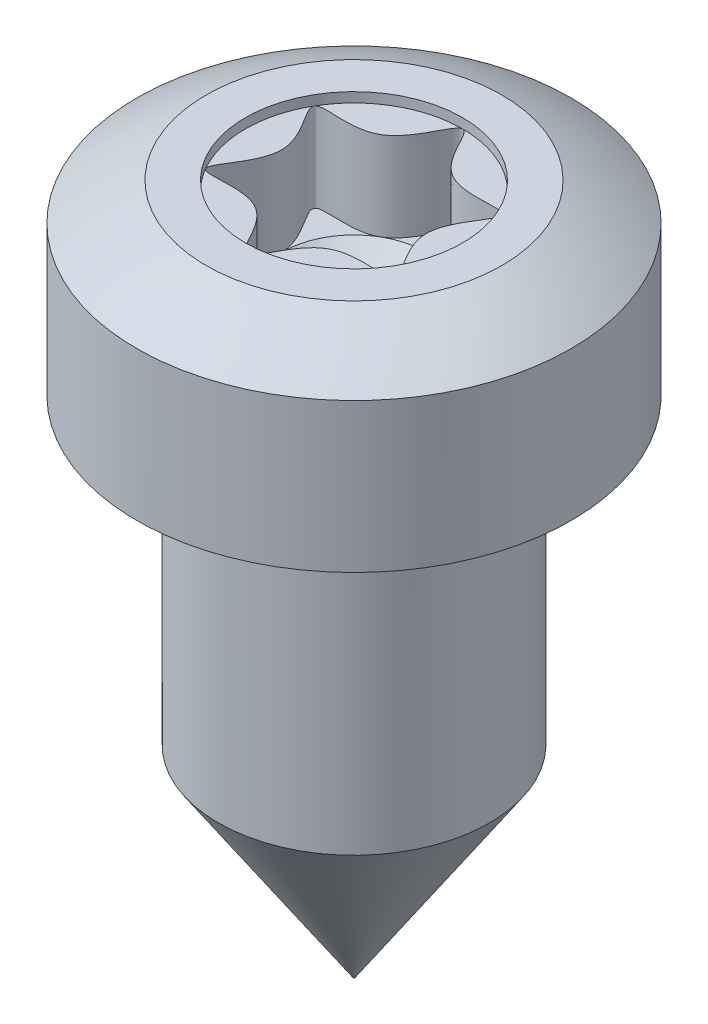
ISO-10303-21;
HEADER;
FILE_DESCRIPTION(('STEP AP214'),'2;1');
FILE_NAME('part.step','',(''),(''),'','','');
FILE_SCHEMA(('AUTOMOTIVE_DESIGN { 1 0 10303 214 1 1 1 1 }'));
ENDSEC;
DATA;
#1=APPLICATION_CONTEXT('core data for automotive mechanical design processes');
#2=APPLICATION_PROTOCOL_DEFINITION('international standard','automotive_design',2000,#1);
#3=PRODUCT_CONTEXT('',#1,'mechanical');
#4=PRODUCT('Part','Part','',(#3));
#5=PRODUCT_RELATED_PRODUCT_CATEGORY('part','',(#4));
#6=PRODUCT_DEFINITION_FORMATION('','',#4);
#7=PRODUCT_DEFINITION_CONTEXT('part definition',#1,'design');
#8=PRODUCT_DEFINITION('design','',#6,#7);
#9=PRODUCT_DEFINITION_SHAPE('','',#8);
#10=(LENGTH_UNIT() NAMED_UNIT(*) SI_UNIT(.MILLI.,.METRE.));
#11=(NAMED_UNIT(*) PLANE_ANGLE_UNIT() SI_UNIT($,.RADIAN.));
#12=(NAMED_UNIT(*) SI_UNIT($,.STERADIAN.) SOLID_ANGLE_UNIT());
#13=UNCERTAINTY_MEASURE_WITH_UNIT(LENGTH_MEASURE(1.E-05),#10,'distance_accuracy_value','');
#14=(GEOMETRIC_REPRESENTATION_CONTEXT(3) GLOBAL_UNCERTAINTY_ASSIGNED_CONTEXT((#13)) GLOBAL_UNIT_ASSIGNED_CONTEXT((#10,
#11,#12)) REPRESENTATION_CONTEXT('',''));
#15=CARTESIAN_POINT('',(0.,0.,0.));
#16=DIRECTION('',(0.,0.,1.));
#17=DIRECTION('',(1.,0.,0.));
#18=AXIS2_PLACEMENT_3D('',#15,#16,#17);
#19=CARTESIAN_POINT('',(0.,7.63,1.4));
#20=DIRECTION('',(0.,1.,0.));
#21=DIRECTION('',(0.,0.,1.));
#22=AXIS2_PLACEMENT_3D('',#19,#20,#21);
#23=PLANE('',#22);
#24=CARTESIAN_POINT('',(0.,7.63,-1.4));
#25=CARTESIAN_POINT('',(0.10065093867207,7.63,-1.4));
#26=CARTESIAN_POINT('',(0.301952816016209,7.63,-0.522997618828571));
#27=CARTESIAN_POINT('',(1.59218873593516,7.63,-0.919250595292857));
#28=CARTESIAN_POINT('',(0.603905632032418,7.63,0.));
#29=CARTESIAN_POINT('',(1.59218873593516,7.63,0.919250595292857));
#30=CARTESIAN_POINT('',(0.301952816016209,7.63,0.52299761882857));
#31=CARTESIAN_POINT('',(0.,7.63,1.83850119058572));
#32=CARTESIAN_POINT('',(-0.301952816016207,7.63,0.522997618828568));
#33=CARTESIAN_POINT('',(-1.59218873593516,7.63,0.919250595292859));
#34=CARTESIAN_POINT('',(-0.603905632032418,7.63,0.));
#35=CARTESIAN_POINT('',(-1.59218873593516,7.63,-0.919250595292858));
#36=CARTESIAN_POINT('',(-0.301952816016208,7.63,-0.52299761882857));
#37=CARTESIAN_POINT('',(-0.100650938672069,7.63,-1.4));
#38=CARTESIAN_POINT('',(0.,7.63,-1.4));
#39=B_SPLINE_CURVE_WITH_KNOTS('',3,(#24,#25,#26,#27,#28,#29,#30,#31,#32,#33,#34,#35,#36,#37,
#38),.UNSPECIFIED.,.T.,.F.,(4,1,1,1,1,1,1,1,1,1,1,1,4),(0.,0.0833333333333334,0.166666666666667,
0.25,0.333333333333333,0.416666666666667,0.5,0.583333333333333,0.666666666666667,0.75,
0.833333333333333,0.916666666666667,1.),.UNSPECIFIED.);
#40=CARTESIAN_POINT('',(0.466666666666667,7.63,-0.808290376865476));
#41=VERTEX_POINT('',#40);
#42=CARTESIAN_POINT('',(0.933333333333333,7.63,0.));
#43=VERTEX_POINT('',#42);
#44=EDGE_CURVE('E135',#41,#43,#39,.T.);
#45=ORIENTED_EDGE('',*,*,#44,.F.);
#46=CARTESIAN_POINT('',(0.,7.63,0.));
#47=DIRECTION('',(0.,-1.,0.));
#48=DIRECTION('',(0.,0.,-1.));
#49=AXIS2_PLACEMENT_3D('',#46,#47,#48);
#50=CIRCLE('',#49,0.933333333333333);
#51=EDGE_CURVE('E47',#41,#43,#50,.T.);
#52=ORIENTED_EDGE('',*,*,#51,.T.);
#53=EDGE_LOOP('',(#45,#52));
#54=FACE_BOUND('',#53,.T.);
#55=ADVANCED_FACE('F32',(#54),#23,.T.);
#56=CARTESIAN_POINT('',(0.466666666666667,7.63,0.808290376865476));
#57=VERTEX_POINT('',#56);
#58=EDGE_CURVE('E150',#43,#57,#39,.T.);
#59=ORIENTED_EDGE('',*,*,#58,.F.);
#60=EDGE_CURVE('E189',#43,#57,#50,.T.);
#61=ORIENTED_EDGE('',*,*,#60,.T.);
#62=EDGE_LOOP('',(#59,#61));
#63=FACE_BOUND('',#62,.T.);
#64=ADVANCED_FACE('F102',(#63),#23,.T.);
#65=CARTESIAN_POINT('',(-0.466666666666666,7.63,0.808290376865476));
#66=VERTEX_POINT('',#65);
#67=EDGE_CURVE('E143',#57,#66,#39,.T.);
#68=ORIENTED_EDGE('',*,*,#67,.F.);
#69=EDGE_CURVE('E228',#57,#66,#50,.T.);
#70=ORIENTED_EDGE('',*,*,#69,.T.);
#71=EDGE_LOOP('',(#68,#70));
#72=FACE_BOUND('',#71,.T.);
#73=ADVANCED_FACE('F109',(#72),#23,.T.);
#74=CARTESIAN_POINT('',(-0.933333333333333,7.63,0.));
#75=VERTEX_POINT('',#74);
#76=EDGE_CURVE('E141',#66,#75,#39,.T.);
#77=ORIENTED_EDGE('',*,*,#76,.F.);
#78=EDGE_CURVE('E232',#66,#75,#50,.T.);
#79=ORIENTED_EDGE('',*,*,#78,.T.);
#80=EDGE_LOOP('',(#77,#79));
#81=FACE_BOUND('',#80,.T.);
#82=ADVANCED_FACE('F124',(#81),#23,.T.);
#83=CARTESIAN_POINT('',(-0.466666666666666,7.63,-0.808290376865476));
#84=VERTEX_POINT('',#83);
#85=EDGE_CURVE('E132',#75,#84,#39,.T.);
#86=ORIENTED_EDGE('',*,*,#85,.F.);
#87=EDGE_CURVE('E235',#75,#84,#50,.T.);
#88=ORIENTED_EDGE('',*,*,#87,.T.);
#89=EDGE_LOOP('',(#86,#88));
#90=FACE_BOUND('',#89,.T.);
#91=ADVANCED_FACE('F115',(#90),#23,.T.);
#92=EDGE_CURVE('E128',#84,#41,#39,.T.);
#93=ORIENTED_EDGE('',*,*,#92,.F.);
#94=EDGE_CURVE('E130',#84,#41,#50,.T.);
#95=ORIENTED_EDGE('',*,*,#94,.T.);
#96=EDGE_LOOP('',(#93,#95));
#97=FACE_BOUND('',#96,.T.);
#98=ADVANCED_FACE('F105',(#97),#23,.T.);
#99=CARTESIAN_POINT('',(0.,8.9,0.));
#100=DIRECTION('',(0.,1.,0.));
#101=DIRECTION('',(0.,0.,1.));
#102=AXIS2_PLACEMENT_3D('',#99,#100,#101);
#103=PLANE('',#102);
#104=CARTESIAN_POINT('',(0.,8.9,0.));
#105=DIRECTION('',(0.,1.,0.));
#106=DIRECTION('',(0.,0.,1.));
#107=AXIS2_PLACEMENT_3D('',#104,#105,#106);
#108=CIRCLE('',#107,1.4);
#109=CARTESIAN_POINT('',(0.,8.9,1.4));
#110=VERTEX_POINT('',#109);
#111=EDGE_CURVE('E151',#110,#110,#108,.T.);
#112=ORIENTED_EDGE('',*,*,#111,.F.);
#113=EDGE_LOOP('',(#112));
#114=FACE_BOUND('',#113,.T.);
#115=CARTESIAN_POINT('',(0.,8.9,0.));
#116=DIRECTION('',(0.,1.,0.));
#117=DIRECTION('',(0.,0.,1.));
#118=AXIS2_PLACEMENT_3D('',#115,#116,#117);
#119=CIRCLE('',#118,1.90599986515636);
#120=CARTESIAN_POINT('',(1.90599986515637,8.9,0.));
#121=VERTEX_POINT('',#120);
#122=EDGE_CURVE('E149',#121,#121,#119,.F.);
#123=ORIENTED_EDGE('',*,*,#122,.F.);
#124=EDGE_LOOP('',(#123));
#125=FACE_BOUND('',#124,.T.);
#126=ADVANCED_FACE('F114',(#114,#125),#103,.T.);
#127=CARTESIAN_POINT('',(0.,0.,0.));
#128=DIRECTION('',(0.,-1.,0.));
#129=DIRECTION('',(0.,0.,-1.));
#130=AXIS2_PLACEMENT_3D('',#127,#128,#129);
#131=CYLINDRICAL_SURFACE('',#130,1.75);
#132=CARTESIAN_POINT('',(0.,2.6,0.));
#133=DIRECTION('',(0.,-1.,0.));
#134=DIRECTION('',(0.,0.,-1.));
#135=AXIS2_PLACEMENT_3D('',#132,#133,#134);
#136=CIRCLE('',#135,1.75);
#137=CARTESIAN_POINT('',(0.,2.6,1.75));
#138=VERTEX_POINT('',#137);
#139=EDGE_CURVE('E184',#138,#138,#136,.T.);
#140=ORIENTED_EDGE('',*,*,#139,.F.);
#141=EDGE_LOOP('',(#140));
#142=FACE_BOUND('',#141,.T.);
#143=CARTESIAN_POINT('',(0.,6.4,0.));
#144=DIRECTION('',(0.,-1.,0.));
#145=DIRECTION('',(0.,0.,-1.));
#146=AXIS2_PLACEMENT_3D('',#143,#144,#145);
#147=CIRCLE('',#146,1.75);
#148=CARTESIAN_POINT('',(0.,6.4,-1.75));
#149=VERTEX_POINT('',#148);
#150=EDGE_CURVE('E40',#149,#149,#147,.T.);
#151=ORIENTED_EDGE('',*,*,#150,.T.);
#152=EDGE_LOOP('',(#151));
#153=FACE_BOUND('',#152,.T.);
#154=ADVANCED_FACE('F121',(#142,#153),#131,.T.);
#155=CARTESIAN_POINT('',(2.8,6.5,0.));
#156=DIRECTION('',(0.,-1.,0.));
#157=DIRECTION('',(0.,0.,-1.));
#158=AXIS2_PLACEMENT_3D('',#155,#156,#157);
#159=PLANE('',#158);
#160=CARTESIAN_POINT('',(0.,6.5,0.));
#161=DIRECTION('',(0.,-1.,0.));
#162=DIRECTION('',(0.,0.,-1.));
#163=AXIS2_PLACEMENT_3D('',#160,#161,#162);
#164=CIRCLE('',#163,1.85);
#165=CARTESIAN_POINT('',(0.,6.5,-1.85));
#166=VERTEX_POINT('',#165);
#167=EDGE_CURVE('E11',#166,#166,#164,.F.);
#168=ORIENTED_EDGE('',*,*,#167,.T.);
#169=EDGE_LOOP('',(#168));
#170=FACE_BOUND('',#169,.T.);
#171=CARTESIAN_POINT('',(0.,6.5,0.));
#172=DIRECTION('',(0.,-1.,0.));
#173=DIRECTION('',(0.,0.,-1.));
#174=AXIS2_PLACEMENT_3D('',#171,#172,#173);
#175=CIRCLE('',#174,2.8);
#176=CARTESIAN_POINT('',(0.,6.5,-2.8));
#177=VERTEX_POINT('',#176);
#178=EDGE_CURVE('E213',#177,#177,#175,.T.);
#179=ORIENTED_EDGE('',*,*,#178,.T.);
#180=EDGE_LOOP('',(#179));
#181=FACE_BOUND('',#180,.T.);
#182=ADVANCED_FACE('F167',(#170,#181),#159,.T.);
#183=CARTESIAN_POINT('',(0.,0.,0.));
#184=DIRECTION('',(0.,-1.,0.));
#185=DIRECTION('',(0.,0.,-1.));
#186=AXIS2_PLACEMENT_3D('',#183,#184,#185);
#187=CYLINDRICAL_SURFACE('',#186,2.8);
#188=CARTESIAN_POINT('',(0.,8.42,0.));
#189=DIRECTION('',(0.,-1.,0.));
#190=DIRECTION('',(0.,0.,-1.));
#191=AXIS2_PLACEMENT_3D('',#188,#189,#190);
#192=CIRCLE('',#191,2.8);
#193=CARTESIAN_POINT('',(2.8,8.42,0.));
#194=VERTEX_POINT('',#193);
#195=EDGE_CURVE('E153',#194,#194,#192,.F.);
#196=ORIENTED_EDGE('',*,*,#195,.F.);
#197=EDGE_LOOP('',(#196));
#198=FACE_BOUND('',#197,.T.);
#199=ORIENTED_EDGE('',*,*,#178,.F.);
#200=EDGE_LOOP('',(#199));
#201=FACE_BOUND('',#200,.T.);
#202=ADVANCED_FACE('F162',(#198,#201),#187,.T.);
#203=CARTESIAN_POINT('',(0.,4.2775369645584,0.));
#204=DIRECTION('',(0.,-1.,0.));
#205=DIRECTION('',(1.,0.,0.));
#206=AXIS2_PLACEMENT_3D('',#203,#204,#205);
#207=SPHERICAL_SURFACE('',#206,5.);
#208=CARTESIAN_POINT('',(2.8,8.42,0.));
#209=CARTESIAN_POINT('',(2.7912278225864,8.42592934661943,0.));
#210=CARTESIAN_POINT('',(2.78243681045547,8.43183082818629,0.));
#211=CARTESIAN_POINT('',(2.76481747274163,8.44357782481942,0.));
#212=CARTESIAN_POINT('',(2.75598914715871,8.44942333988567,0.));
#213=CARTESIAN_POINT('',(2.73829553852357,8.46105816712207,0.));
#214=CARTESIAN_POINT('',(2.72943025547134,8.46684747929221,0.));
#215=CARTESIAN_POINT('',(2.71166308977534,8.47836966721441,0.));
#216=CARTESIAN_POINT('',(2.70276120713157,8.48410254296645,0.));
#217=CARTESIAN_POINT('',(2.68492120149922,8.495511626646,0.));
#218=CARTESIAN_POINT('',(2.67598307851064,8.5011878345735,0.));
#219=CARTESIAN_POINT('',(2.65807095292703,8.51248335352801,0.));
#220=CARTESIAN_POINT('',(2.649096950332,8.51810266455501,0.));
#221=CARTESIAN_POINT('',(2.6311134277141,8.52928416291724,0.));
#222=CARTESIAN_POINT('',(2.62210390769124,8.53484635025245,0.));
#223=CARTESIAN_POINT('',(2.60404971383186,8.54591337674836,0.));
#224=CARTESIAN_POINT('',(2.59500503999533,8.55141821590905,0.));
#225=CARTESIAN_POINT('',(2.57688090354098,8.56237032388684,0.));
#226=CARTESIAN_POINT('',(2.56780144092315,8.56781759270394,0.));
#227=CARTESIAN_POINT('',(2.54960809334275,8.57865434014919,0.));
#228=CARTESIAN_POINT('',(2.54049420838018,8.58404381877733,0.));
#229=CARTESIAN_POINT('',(2.52223238393604,8.59476476833158,0.));
#230=CARTESIAN_POINT('',(2.51308444445448,8.60009623925768,0.));
#231=CARTESIAN_POINT('',(2.49475488017253,8.61070095823591,0.));
#232=CARTESIAN_POINT('',(2.48557325537214,8.61597420628803,0.));
#233=CARTESIAN_POINT('',(2.46717669101221,8.62646226669615,0.));
#234=CARTESIAN_POINT('',(2.45796175145267,8.63167707905214,0.));
#235=CARTESIAN_POINT('',(2.43949892947865,8.64204805760427,0.));
#236=CARTESIAN_POINT('',(2.43025104706416,8.64720422380039,0.));
#237=CARTESIAN_POINT('',(2.41172271261399,8.65745770193593,0.));
#238=CARTESIAN_POINT('',(2.4024422605783,8.66255501387533,0.));
#239=CARTESIAN_POINT('',(2.38384916143396,8.67269057777586,0.));
#240=CARTESIAN_POINT('',(2.37453651432529,8.67772882973698,0.));
#241=CARTESIAN_POINT('',(2.35587940088256,8.68774607034297,0.));
#242=CARTESIAN_POINT('',(2.34653493454849,8.69272505898783,0.));
#243=CARTESIAN_POINT('',(2.3278145597867,8.70262357201513,0.));
#244=CARTESIAN_POINT('',(2.31843865135899,8.70754309639756,0.));
#245=CARTESIAN_POINT('',(2.29965577081064,8.71732248235373,0.));
#246=CARTESIAN_POINT('',(2.29024879869001,8.72218234392747,0.));
#247=CARTESIAN_POINT('',(2.27140417041025,8.73184220812791,0.));
#248=CARTESIAN_POINT('',(2.26196651425112,8.7366422107546,0.));
#249=CARTESIAN_POINT('',(2.24306089878716,8.74618216333845,0.));
#250=CARTESIAN_POINT('',(2.23359293948233,8.7509221132956,0.));
#251=CARTESIAN_POINT('',(2.21462709984275,8.76034176924151,0.));
#252=CARTESIAN_POINT('',(2.20512921950801,8.76502147523026,0.));
#253=CARTESIAN_POINT('',(2.18610392113199,8.77432045437189,0.));
#254=CARTESIAN_POINT('',(2.1765765030907,8.77893972752477,0.));
#255=CARTESIAN_POINT('',(2.15749251381708,8.78811765456619,0.));
#256=CARTESIAN_POINT('',(2.14793594258475,8.79267630845473,0.));
#257=CARTESIAN_POINT('',(2.12879403262106,8.80173281298547,0.));
#258=CARTESIAN_POINT('',(2.11920869388971,8.80623066362766,0.));
#259=CARTESIAN_POINT('',(2.10000963578117,8.81516538013791,0.));
#260=CARTESIAN_POINT('',(2.09039591640398,8.81960224600595,0.));
#261=CARTESIAN_POINT('',(2.07114048500196,8.82841481390043,0.));
#262=CARTESIAN_POINT('',(2.06149877297713,8.83279051592686,0.));
#263=CARTESIAN_POINT('',(2.0421877454092,8.8414805795426,0.));
#264=CARTESIAN_POINT('',(2.03251842986612,8.84579494113192,0.));
#265=CARTESIAN_POINT('',(2.01315258549972,8.85436214974065,0.));
#266=CARTESIAN_POINT('',(2.00345605667641,8.85861499676007,0.));
#267=CARTESIAN_POINT('',(1.98403617710609,8.86705900462705,0.));
#268=CARTESIAN_POINT('',(1.97431282635908,8.87125016547461,0.));
#269=CARTESIAN_POINT('',(1.95483969530497,8.87957063170577,0.));
#270=CARTESIAN_POINT('',(1.94508991499787,8.88369993708937,0.));
#271=CARTESIAN_POINT('',(1.92556431853537,8.89189652626763,0.));
#272=CARTESIAN_POINT('',(1.91578850237999,8.89596381006229,0.));
#273=CARTESIAN_POINT('',(1.90599986515637,8.9,0.));
#274=B_SPLINE_CURVE_WITH_KNOTS('',3,(#208,#209,#210,#211,#212,#213,#214,#215,#216,#217,#218,
#219,#220,#221,#222,#223,#224,#225,#226,#227,#228,#229,#230,#231,#232,#233,#234,#235,#236,#237,
#238,#239,#240,#241,#242,#243,#244,#245,#246,#247,#248,#249,#250,#251,#252,#253,#254,#255,#256,
#257,#258,#259,#260,#261,#262,#263,#264,#265,#266,#267,#268,#269,#270,#271,#272,#273),
.UNSPECIFIED.,.F.,.F.,(4,2,2,2,2,2,2,2,2,2,2,2,2,2,2,2,2,2,2,2,2,2,2,2,2,2,2,2,2,2,2,2,4),(0.,
0.0317643013016592,0.0635286026033185,0.0952929039049785,0.127057205206638,0.158821506508299,
0.190585807809957,0.222350109111616,0.254114410413277,0.285878711714937,0.317643013016596,
0.349407314318256,0.381171615619916,0.412935916921576,0.444700218223236,0.476464519524896,
0.508228820826556,0.539993122128215,0.571757423429874,0.603521724731535,0.635286026033194,
0.667050327334854,0.698814628636514,0.730578929938174,0.762343231239833,0.794107532541494,
0.825871833843153,0.857636135144813,0.889400436446472,0.921164737748132,0.952929039049792,
0.984693340351452,1.01645764165311),.UNSPECIFIED.);
#275=EDGE_CURVE('BSEAM159',#194,#121,#274,.T.);
#276=ORIENTED_EDGE('',*,*,#195,.T.);
#277=ORIENTED_EDGE('',*,*,#122,.T.);
#278=ORIENTED_EDGE('',*,*,#275,.T.);
#279=ORIENTED_EDGE('',*,*,#275,.F.);
#280=EDGE_LOOP('',(#276,#278,#277,#279));
#281=FACE_BOUND('',#280,.T.);
#282=ADVANCED_FACE('F159',(#281),#207,.T.);
#283=CARTESIAN_POINT('',(0.,8.773,0.));
#284=DIRECTION('',(0.,1.,0.));
#285=DIRECTION('',(0.,0.,1.));
#286=AXIS2_PLACEMENT_3D('',#283,#284,#285);
#287=CYLINDRICAL_SURFACE('',#286,1.4);
#288=ORIENTED_EDGE('',*,*,#111,.T.);
#289=EDGE_LOOP('',(#288));
#290=FACE_BOUND('',#289,.T.);
#291=CARTESIAN_POINT('',(0.,8.773,0.));
#292=DIRECTION('',(0.,1.,0.));
#293=DIRECTION('',(0.,0.,1.));
#294=AXIS2_PLACEMENT_3D('',#291,#292,#293);
#295=CIRCLE('',#294,1.4);
#296=CARTESIAN_POINT('',(1.21243556529821,8.773,0.699999999999999));
#297=VERTEX_POINT('',#296);
#298=CARTESIAN_POINT('',(1.21243556529821,8.773,-0.7));
#299=VERTEX_POINT('',#298);
#300=EDGE_CURVE('E191',#297,#299,#295,.T.);
#301=ORIENTED_EDGE('',*,*,#300,.F.);
#302=CARTESIAN_POINT('',(0.,8.773,1.4));
#303=VERTEX_POINT('',#302);
#304=EDGE_CURVE('E133',#303,#297,#295,.T.);
#305=ORIENTED_EDGE('',*,*,#304,.F.);
#306=CARTESIAN_POINT('',(-1.21243556529821,8.773,0.7));
#307=VERTEX_POINT('',#306);
#308=EDGE_CURVE('E192',#307,#303,#295,.T.);
#309=ORIENTED_EDGE('',*,*,#308,.F.);
#310=CARTESIAN_POINT('',(-1.21243556529821,8.773,-0.7));
#311=VERTEX_POINT('',#310);
#312=EDGE_CURVE('E198',#311,#307,#295,.T.);
#313=ORIENTED_EDGE('',*,*,#312,.F.);
#314=CARTESIAN_POINT('',(0.,8.773,-1.4));
#315=VERTEX_POINT('',#314);
#316=EDGE_CURVE('E202',#315,#311,#295,.T.);
#317=ORIENTED_EDGE('',*,*,#316,.F.);
#318=EDGE_CURVE('E54',#299,#315,#295,.T.);
#319=ORIENTED_EDGE('',*,*,#318,.F.);
#320=EDGE_LOOP('',(#301,#305,#309,#313,#317,#319));
#321=FACE_BOUND('',#320,.T.);
#322=ADVANCED_FACE('F161',(#290,#321),#287,.F.);
#323=CARTESIAN_POINT('',(0.,8.773,0.));
#324=DIRECTION('',(0.,1.,0.));
#325=DIRECTION('',(0.,0.,1.));
#326=AXIS2_PLACEMENT_3D('',#323,#324,#325);
#327=PLANE('',#326);
#328=ORIENTED_EDGE('',*,*,#316,.T.);
#329=CARTESIAN_POINT('',(0.,8.773,-1.4));
#330=CARTESIAN_POINT('',(0.10065093867207,8.773,-1.4));
#331=CARTESIAN_POINT('',(0.301952816016209,8.773,-0.522997618828571));
#332=CARTESIAN_POINT('',(1.59218873593516,8.773,-0.919250595292857));
#333=CARTESIAN_POINT('',(0.603905632032418,8.773,0.));
#334=CARTESIAN_POINT('',(1.59218873593516,8.773,0.919250595292857));
#335=CARTESIAN_POINT('',(0.301952816016209,8.773,0.52299761882857));
#336=CARTESIAN_POINT('',(0.,8.773,1.83850119058572));
#337=CARTESIAN_POINT('',(-0.301952816016207,8.773,0.522997618828568));
#338=CARTESIAN_POINT('',(-1.59218873593516,8.773,0.919250595292859));
#339=CARTESIAN_POINT('',(-0.603905632032418,8.773,0.));
#340=CARTESIAN_POINT('',(-1.59218873593516,8.773,-0.919250595292858));
#341=CARTESIAN_POINT('',(-0.301952816016208,8.773,-0.52299761882857));
#342=CARTESIAN_POINT('',(-0.100650938672069,8.773,-1.4));
#343=CARTESIAN_POINT('',(0.,8.773,-1.4));
#344=B_SPLINE_CURVE_WITH_KNOTS('',3,(#329,#330,#331,#332,#333,#334,#335,#336,#337,#338,#339,
#340,#341,#342,#343),.UNSPECIFIED.,.T.,.F.,(4,1,1,1,1,1,1,1,1,1,1,1,4),(0.,0.0833333333333334,
0.166666666666667,0.25,0.333333333333333,0.416666666666667,0.5,0.583333333333333,
0.666666666666667,0.75,0.833333333333333,0.916666666666667,1.),.UNSPECIFIED.);
#345=EDGE_CURVE('E220',#315,#311,#344,.F.);
#346=ORIENTED_EDGE('',*,*,#345,.F.);
#347=EDGE_LOOP('',(#328,#346));
#348=FACE_BOUND('',#347,.T.);
#349=ADVANCED_FACE('F251',(#348),#327,.T.);
#350=ORIENTED_EDGE('',*,*,#312,.T.);
#351=EDGE_CURVE('E238',#311,#307,#344,.F.);
#352=ORIENTED_EDGE('',*,*,#351,.F.);
#353=EDGE_LOOP('',(#350,#352));
#354=FACE_BOUND('',#353,.T.);
#355=ADVANCED_FACE('F253',(#354),#327,.T.);
#356=ORIENTED_EDGE('',*,*,#308,.T.);
#357=EDGE_CURVE('E241',#307,#303,#344,.F.);
#358=ORIENTED_EDGE('',*,*,#357,.F.);
#359=EDGE_LOOP('',(#356,#358));
#360=FACE_BOUND('',#359,.T.);
#361=ADVANCED_FACE('F258',(#360),#327,.T.);
#362=ORIENTED_EDGE('',*,*,#304,.T.);
#363=EDGE_CURVE('E243',#303,#297,#344,.F.);
#364=ORIENTED_EDGE('',*,*,#363,.F.);
#365=EDGE_LOOP('',(#362,#364));
#366=FACE_BOUND('',#365,.T.);
#367=ADVANCED_FACE('F264',(#366),#327,.T.);
#368=ORIENTED_EDGE('',*,*,#300,.T.);
#369=EDGE_CURVE('E219',#297,#299,#344,.F.);
#370=ORIENTED_EDGE('',*,*,#369,.F.);
#371=EDGE_LOOP('',(#368,#370));
#372=FACE_BOUND('',#371,.T.);
#373=ADVANCED_FACE('F247',(#372),#327,.T.);
#374=ORIENTED_EDGE('',*,*,#318,.T.);
#375=EDGE_CURVE('E215',#299,#315,#344,.F.);
#376=ORIENTED_EDGE('',*,*,#375,.F.);
#377=EDGE_LOOP('',(#374,#376));
#378=FACE_BOUND('',#377,.T.);
#379=ADVANCED_FACE('F96',(#378),#327,.T.);
#380=DIRECTION('',(0.,1.,0.));
#381=VECTOR('',#380,1.);
#382=SURFACE_OF_LINEAR_EXTRUSION('',#39,#381);
#383=ORIENTED_EDGE('',*,*,#44,.T.);
#384=ORIENTED_EDGE('',*,*,#58,.T.);
#385=ORIENTED_EDGE('',*,*,#67,.T.);
#386=ORIENTED_EDGE('',*,*,#76,.T.);
#387=ORIENTED_EDGE('',*,*,#85,.T.);
#388=ORIENTED_EDGE('',*,*,#92,.T.);
#389=EDGE_LOOP('',(#383,#384,#385,#386,#387,#388));
#390=FACE_BOUND('',#389,.T.);
#391=ORIENTED_EDGE('',*,*,#375,.T.);
#392=ORIENTED_EDGE('',*,*,#345,.T.);
#393=ORIENTED_EDGE('',*,*,#351,.T.);
#394=ORIENTED_EDGE('',*,*,#357,.T.);
#395=ORIENTED_EDGE('',*,*,#363,.T.);
#396=ORIENTED_EDGE('',*,*,#369,.T.);
#397=EDGE_LOOP('',(#391,#392,#393,#394,#395,#396));
#398=FACE_BOUND('',#397,.T.);
#399=ADVANCED_FACE('F88',(#390,#398),#382,.T.);
#400=CARTESIAN_POINT('',(0.,6.74,0.));
#401=DIRECTION('',(0.,1.,0.));
#402=DIRECTION('',(0.,0.,1.));
#403=AXIS2_PLACEMENT_3D('',#400,#401,#402);
#404=CONICAL_SURFACE('',#403,0.,0.809159686733108);
#405=ORIENTED_EDGE('',*,*,#51,.F.);
#406=ORIENTED_EDGE('',*,*,#94,.F.);
#407=ORIENTED_EDGE('',*,*,#87,.F.);
#408=ORIENTED_EDGE('',*,*,#78,.F.);
#409=ORIENTED_EDGE('',*,*,#69,.F.);
#410=ORIENTED_EDGE('',*,*,#60,.F.);
#411=EDGE_LOOP('',(#405,#406,#407,#408,#409,#410));
#412=FACE_BOUND('',#411,.T.);
#413=CARTESIAN_POINT('',(0.,6.74,0.));
#414=VERTEX_POINT('',#413);
#415=VERTEX_LOOP('',#414);
#416=FACE_BOUND('',#415,.T.);
#417=ADVANCED_FACE('F86',(#412,#416),#404,.F.);
#418=CARTESIAN_POINT('',(0.,6.4,0.));
#419=DIRECTION('',(0.,-1.,0.));
#420=DIRECTION('',(0.,0.,-1.));
#421=AXIS2_PLACEMENT_3D('',#418,#419,#420);
#422=TOROIDAL_SURFACE('',#421,1.85,0.1);
#423=ORIENTED_EDGE('',*,*,#167,.F.);
#424=EDGE_LOOP('',(#423));
#425=FACE_BOUND('',#424,.T.);
#426=ORIENTED_EDGE('',*,*,#150,.F.);
#427=EDGE_LOOP('',(#426));
#428=FACE_BOUND('',#427,.T.);
#429=ADVANCED_FACE('F34',(#425,#428),#422,.F.);
#430=CARTESIAN_POINT('',(0.,2.6,0.));
#431=DIRECTION('',(0.,1.,0.));
#432=DIRECTION('',(0.,0.,1.));
#433=AXIS2_PLACEMENT_3D('',#430,#431,#432);
#434=CONICAL_SURFACE('',#433,1.75,0.58977565133498);
#435=CARTESIAN_POINT('',(0.,0.,0.));
#436=DIRECTION('',(0.,-1.,0.));
#437=DIRECTION('',(0.,0.,-1.));
#438=AXIS2_PLACEMENT_3D('',#435,#436,#437);
#439=CIRCLE('',#438,0.01);
#440=CARTESIAN_POINT('',(0.,0.,0.00999999999999959));
#441=VERTEX_POINT('',#440);
#442=EDGE_CURVE('E183',#441,#441,#439,.T.);
#443=CARTESIAN_POINT('',(0.,0.,0.00999999999999959));
#444=CARTESIAN_POINT('',(0.,0.0270833333333334,0.0281249999999997));
#445=CARTESIAN_POINT('',(0.,0.0541666666666668,0.0462499999999997));
#446=CARTESIAN_POINT('',(0.,0.108333333333333,0.0824999999999997));
#447=CARTESIAN_POINT('',(0.,0.135416666666667,0.100625));
#448=CARTESIAN_POINT('',(0.,0.189583333333333,0.136875));
#449=CARTESIAN_POINT('',(0.,0.216666666666667,0.155));
#450=CARTESIAN_POINT('',(0.,0.270833333333333,0.19125));
#451=CARTESIAN_POINT('',(0.,0.297916666666667,0.209375));
#452=CARTESIAN_POINT('',(0.,0.352083333333333,0.245625));
#453=CARTESIAN_POINT('',(0.,0.379166666666667,0.26375));
#454=CARTESIAN_POINT('',(0.,0.433333333333333,0.3));
#455=CARTESIAN_POINT('',(0.,0.460416666666667,0.318125));
#456=CARTESIAN_POINT('',(0.,0.514583333333333,0.354375));
#457=CARTESIAN_POINT('',(0.,0.541666666666667,0.3725));
#458=CARTESIAN_POINT('',(0.,0.595833333333333,0.40875));
#459=CARTESIAN_POINT('',(0.,0.622916666666667,0.426875));
#460=CARTESIAN_POINT('',(0.,0.677083333333333,0.463125));
#461=CARTESIAN_POINT('',(0.,0.704166666666667,0.48125));
#462=CARTESIAN_POINT('',(0.,0.758333333333333,0.5175));
#463=CARTESIAN_POINT('',(0.,0.785416666666667,0.535625));
#464=CARTESIAN_POINT('',(0.,0.839583333333333,0.571875));
#465=CARTESIAN_POINT('',(0.,0.866666666666667,0.59));
#466=CARTESIAN_POINT('',(0.,0.920833333333333,0.62625));
#467=CARTESIAN_POINT('',(0.,0.947916666666667,0.644375));
#468=CARTESIAN_POINT('',(0.,1.00208333333333,0.680625));
#469=CARTESIAN_POINT('',(0.,1.02916666666667,0.69875));
#470=CARTESIAN_POINT('',(0.,1.08333333333333,0.735));
#471=CARTESIAN_POINT('',(0.,1.11041666666667,0.753125));
#472=CARTESIAN_POINT('',(0.,1.16458333333333,0.789375));
#473=CARTESIAN_POINT('',(0.,1.19166666666667,0.8075));
#474=CARTESIAN_POINT('',(0.,1.24583333333333,0.84375));
#475=CARTESIAN_POINT('',(0.,1.27291666666667,0.861875));
#476=CARTESIAN_POINT('',(0.,1.32708333333333,0.898125));
#477=CARTESIAN_POINT('',(0.,1.35416666666667,0.91625));
#478=CARTESIAN_POINT('',(0.,1.40833333333333,0.9525));
#479=CARTESIAN_POINT('',(0.,1.43541666666667,0.970625));
#480=CARTESIAN_POINT('',(0.,1.48958333333333,1.006875));
#481=CARTESIAN_POINT('',(0.,1.51666666666667,1.025));
#482=CARTESIAN_POINT('',(0.,1.57083333333333,1.06125));
#483=CARTESIAN_POINT('',(0.,1.59791666666667,1.079375));
#484=CARTESIAN_POINT('',(0.,1.65208333333333,1.115625));
#485=CARTESIAN_POINT('',(0.,1.67916666666667,1.13375));
#486=CARTESIAN_POINT('',(0.,1.73333333333333,1.17));
#487=CARTESIAN_POINT('',(0.,1.76041666666667,1.188125));
#488=CARTESIAN_POINT('',(0.,1.81458333333333,1.224375));
#489=CARTESIAN_POINT('',(0.,1.84166666666667,1.2425));
#490=CARTESIAN_POINT('',(0.,1.89583333333333,1.27875));
#491=CARTESIAN_POINT('',(0.,1.92291666666667,1.296875));
#492=CARTESIAN_POINT('',(0.,1.97708333333333,1.333125));
#493=CARTESIAN_POINT('',(0.,2.00416666666667,1.35125));
#494=CARTESIAN_POINT('',(0.,2.05833333333333,1.3875));
#495=CARTESIAN_POINT('',(0.,2.08541666666667,1.405625));
#496=CARTESIAN_POINT('',(0.,2.13958333333333,1.441875));
#497=CARTESIAN_POINT('',(0.,2.16666666666667,1.46));
#498=CARTESIAN_POINT('',(0.,2.22083333333333,1.49625));
#499=CARTESIAN_POINT('',(0.,2.24791666666667,1.514375));
#500=CARTESIAN_POINT('',(0.,2.30208333333333,1.550625));
#501=CARTESIAN_POINT('',(0.,2.32916666666667,1.56875));
#502=CARTESIAN_POINT('',(0.,2.38333333333333,1.605));
#503=CARTESIAN_POINT('',(0.,2.41041666666667,1.623125));
#504=CARTESIAN_POINT('',(0.,2.46458333333333,1.659375));
#505=CARTESIAN_POINT('',(0.,2.49166666666667,1.6775));
#506=CARTESIAN_POINT('',(0.,2.54583333333333,1.71375));
#507=CARTESIAN_POINT('',(0.,2.57291666666667,1.731875));
#508=CARTESIAN_POINT('',(0.,2.6,1.75));
#509=B_SPLINE_CURVE_WITH_KNOTS('',3,(#443,#444,#445,#446,#447,#448,#449,#450,#451,#452,#453,
#454,#455,#456,#457,#458,#459,#460,#461,#462,#463,#464,#465,#466,#467,#468,#469,#470,#471,#472,
#473,#474,#475,#476,#477,#478,#479,#480,#481,#482,#483,#484,#485,#486,#487,#488,#489,#490,#491,
#492,#493,#494,#495,#496,#497,#498,#499,#500,#501,#502,#503,#504,#505,#506,#507,#508),
.UNSPECIFIED.,.F.,.F.,(4,2,2,2,2,2,2,2,2,2,2,2,2,2,2,2,2,2,2,2,2,2,2,2,2,2,2,2,2,2,2,2,4),(0.,
0.0977660632581677,0.195532126516335,0.293298189774502,0.39106425303267,0.488830316290837,
0.586596379549005,0.684362442807172,0.78212850606534,0.879894569323507,0.977660632581675,
1.07542669583984,1.17319275909801,1.27095882235618,1.36872488561434,1.46649094887251,
1.56425701213068,1.66202307538885,1.75978913864701,1.85755520190518,1.95532126516335,
2.05308732842152,2.15085339167968,2.24861945493785,2.34638551819602,2.44415158145419,
2.54191764471235,2.63968370797052,2.73744977122869,2.83521583448686,2.93298189774502,
3.03074796100319,3.12851402426136),.UNSPECIFIED.);
#510=EDGE_CURVE('BSEAM94',#441,#138,#509,.T.);
#511=ORIENTED_EDGE('',*,*,#442,.F.);
#512=ORIENTED_EDGE('',*,*,#139,.T.);
#513=ORIENTED_EDGE('',*,*,#510,.T.);
#514=ORIENTED_EDGE('',*,*,#510,.F.);
#515=EDGE_LOOP('',(#511,#513,#512,#514));
#516=FACE_BOUND('',#515,.T.);
#517=ADVANCED_FACE('F94',(#516),#434,.T.);
#518=CARTESIAN_POINT('',(1.75,0.,0.));
#519=DIRECTION('',(0.,-1.,0.));
#520=DIRECTION('',(0.,0.,-1.));
#521=AXIS2_PLACEMENT_3D('',#518,#519,#520);
#522=PLANE('',#521);
#523=ORIENTED_EDGE('',*,*,#442,.T.);
#524=EDGE_LOOP('',(#523));
#525=FACE_BOUND('',#524,.T.);
#526=ADVANCED_FACE('F174',(#525),#522,.T.);
#527=CLOSED_SHELL('',(#55,#64,#73,#82,#91,#98,#126,#154,#182,#202,#282,#322,#349,#355,#361,#367,
#373,#379,#399,#417,#429,#517,#526));
#528=MANIFOLD_SOLID_BREP('B2',#527);
#529=ADVANCED_BREP_SHAPE_REPRESENTATION('',(#18,#528),#14);
#530=SHAPE_DEFINITION_REPRESENTATION(#9,#529);
ENDSEC;
END-ISO-10303-21;
